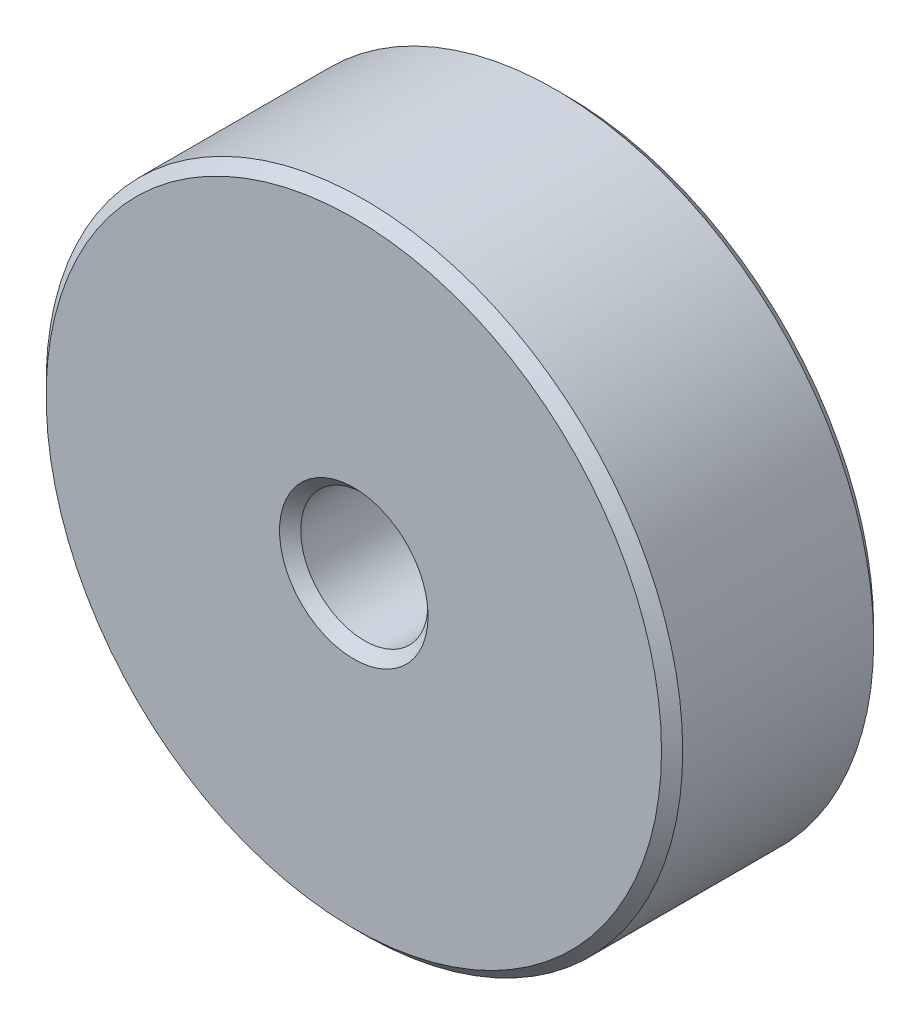
ISO-10303-21;
HEADER;
FILE_DESCRIPTION(('STEP AP214'),'2;1');
FILE_NAME('part.step','',(''),(''),'','','');
FILE_SCHEMA(('AUTOMOTIVE_DESIGN { 1 0 10303 214 1 1 1 1 }'));
ENDSEC;
DATA;
#1=APPLICATION_CONTEXT('core data for automotive mechanical design processes');
#2=APPLICATION_PROTOCOL_DEFINITION('international standard','automotive_design',2000,#1);
#3=PRODUCT_CONTEXT('',#1,'mechanical');
#4=PRODUCT('Part','Part','',(#3));
#5=PRODUCT_RELATED_PRODUCT_CATEGORY('part','',(#4));
#6=PRODUCT_DEFINITION_FORMATION('','',#4);
#7=PRODUCT_DEFINITION_CONTEXT('part definition',#1,'design');
#8=PRODUCT_DEFINITION('design','',#6,#7);
#9=PRODUCT_DEFINITION_SHAPE('','',#8);
#10=(LENGTH_UNIT() NAMED_UNIT(*) SI_UNIT(.MILLI.,.METRE.));
#11=(NAMED_UNIT(*) PLANE_ANGLE_UNIT() SI_UNIT($,.RADIAN.));
#12=(NAMED_UNIT(*) SI_UNIT($,.STERADIAN.) SOLID_ANGLE_UNIT());
#13=UNCERTAINTY_MEASURE_WITH_UNIT(LENGTH_MEASURE(1.E-05),#10,'distance_accuracy_value','');
#14=(GEOMETRIC_REPRESENTATION_CONTEXT(3) GLOBAL_UNCERTAINTY_ASSIGNED_CONTEXT((#13)) GLOBAL_UNIT_ASSIGNED_CONTEXT((#10,
#11,#12)) REPRESENTATION_CONTEXT('',''));
#15=CARTESIAN_POINT('',(0.,0.,0.));
#16=DIRECTION('',(0.,0.,1.));
#17=DIRECTION('',(1.,0.,0.));
#18=AXIS2_PLACEMENT_3D('',#15,#16,#17);
#19=CARTESIAN_POINT('',(0.,0.,10.));
#20=DIRECTION('',(0.,0.,1.));
#21=DIRECTION('',(1.,0.,0.));
#22=AXIS2_PLACEMENT_3D('',#19,#20,#21);
#23=PLANE('',#22);
#24=CARTESIAN_POINT('',(0.,0.,10.));
#25=DIRECTION('',(0.,0.,1.));
#26=DIRECTION('',(1.,0.,0.));
#27=AXIS2_PLACEMENT_3D('',#24,#25,#26);
#28=CIRCLE('',#27,3.5);
#29=CARTESIAN_POINT('',(3.5,0.,10.));
#30=VERTEX_POINT('',#29);
#31=EDGE_CURVE('E40',#30,#30,#28,.F.);
#32=ORIENTED_EDGE('',*,*,#31,.T.);
#33=EDGE_LOOP('',(#32));
#34=FACE_BOUND('',#33,.T.);
#35=CARTESIAN_POINT('',(0.,0.,10.));
#36=DIRECTION('',(0.,0.,1.));
#37=DIRECTION('',(1.,0.,0.));
#38=AXIS2_PLACEMENT_3D('',#35,#36,#37);
#39=CIRCLE('',#38,14.5);
#40=CARTESIAN_POINT('',(14.5,0.,10.));
#41=VERTEX_POINT('',#40);
#42=EDGE_CURVE('E44',#41,#41,#39,.T.);
#43=ORIENTED_EDGE('',*,*,#42,.T.);
#44=EDGE_LOOP('',(#43));
#45=FACE_BOUND('',#44,.T.);
#46=ADVANCED_FACE('F29',(#34,#45),#23,.T.);
#47=CARTESIAN_POINT('',(0.,0.,0.));
#48=DIRECTION('',(0.,0.,1.));
#49=DIRECTION('',(1.,0.,0.));
#50=AXIS2_PLACEMENT_3D('',#47,#48,#49);
#51=PLANE('',#50);
#52=CARTESIAN_POINT('',(0.,0.,0.));
#53=DIRECTION('',(0.,0.,1.));
#54=DIRECTION('',(1.,0.,0.));
#55=AXIS2_PLACEMENT_3D('',#52,#53,#54);
#56=CIRCLE('',#55,3.5);
#57=CARTESIAN_POINT('',(3.5,0.,0.));
#58=VERTEX_POINT('',#57);
#59=EDGE_CURVE('E55',#58,#58,#56,.T.);
#60=ORIENTED_EDGE('',*,*,#59,.T.);
#61=EDGE_LOOP('',(#60));
#62=FACE_BOUND('',#61,.T.);
#63=CARTESIAN_POINT('',(0.,0.,0.));
#64=DIRECTION('',(0.,0.,1.));
#65=DIRECTION('',(1.,0.,0.));
#66=AXIS2_PLACEMENT_3D('',#63,#64,#65);
#67=CIRCLE('',#66,14.5);
#68=CARTESIAN_POINT('',(14.5,0.,0.));
#69=VERTEX_POINT('',#68);
#70=EDGE_CURVE('E58',#69,#69,#67,.F.);
#71=ORIENTED_EDGE('',*,*,#70,.T.);
#72=EDGE_LOOP('',(#71));
#73=FACE_BOUND('',#72,.T.);
#74=ADVANCED_FACE('F62',(#62,#73),#51,.F.);
#75=CARTESIAN_POINT('',(0.,0.,10.));
#76=DIRECTION('',(0.,0.,-1.));
#77=DIRECTION('',(-1.,0.,0.));
#78=AXIS2_PLACEMENT_3D('',#75,#76,#77);
#79=CYLINDRICAL_SURFACE('',#78,15.);
#80=CARTESIAN_POINT('',(0.,0.,0.500000000000002));
#81=DIRECTION('',(0.,0.,1.));
#82=DIRECTION('',(1.,0.,0.));
#83=AXIS2_PLACEMENT_3D('',#80,#81,#82);
#84=CIRCLE('',#83,15.);
#85=CARTESIAN_POINT('',(15.,0.,0.500000000000002));
#86=VERTEX_POINT('',#85);
#87=EDGE_CURVE('E10',#86,#86,#84,.T.);
#88=ORIENTED_EDGE('',*,*,#87,.T.);
#89=EDGE_LOOP('',(#88));
#90=FACE_BOUND('',#89,.T.);
#91=CARTESIAN_POINT('',(0.,0.,9.5));
#92=DIRECTION('',(0.,0.,1.));
#93=DIRECTION('',(1.,0.,0.));
#94=AXIS2_PLACEMENT_3D('',#91,#92,#93);
#95=CIRCLE('',#94,15.);
#96=CARTESIAN_POINT('',(15.,0.,9.5));
#97=VERTEX_POINT('',#96);
#98=EDGE_CURVE('E36',#97,#97,#95,.F.);
#99=ORIENTED_EDGE('',*,*,#98,.T.);
#100=EDGE_LOOP('',(#99));
#101=FACE_BOUND('',#100,.T.);
#102=ADVANCED_FACE('F82',(#90,#101),#79,.T.);
#103=CARTESIAN_POINT('',(0.,0.,10.));
#104=DIRECTION('',(0.,0.,-1.));
#105=DIRECTION('',(-1.,0.,0.));
#106=AXIS2_PLACEMENT_3D('',#103,#104,#105);
#107=CYLINDRICAL_SURFACE('',#106,3.);
#108=CARTESIAN_POINT('',(0.,0.,0.499999999999999));
#109=DIRECTION('',(0.,0.,1.));
#110=DIRECTION('',(1.,0.,0.));
#111=AXIS2_PLACEMENT_3D('',#108,#109,#110);
#112=CIRCLE('',#111,3.);
#113=CARTESIAN_POINT('',(3.,0.,0.499999999999999));
#114=VERTEX_POINT('',#113);
#115=EDGE_CURVE('E49',#114,#114,#112,.F.);
#116=ORIENTED_EDGE('',*,*,#115,.T.);
#117=EDGE_LOOP('',(#116));
#118=FACE_BOUND('',#117,.T.);
#119=CARTESIAN_POINT('',(0.,0.,9.5));
#120=DIRECTION('',(0.,0.,1.));
#121=DIRECTION('',(1.,0.,0.));
#122=AXIS2_PLACEMENT_3D('',#119,#120,#121);
#123=CIRCLE('',#122,3.);
#124=CARTESIAN_POINT('',(3.,0.,9.5));
#125=VERTEX_POINT('',#124);
#126=EDGE_CURVE('E52',#125,#125,#123,.T.);
#127=ORIENTED_EDGE('',*,*,#126,.T.);
#128=EDGE_LOOP('',(#127));
#129=FACE_BOUND('',#128,.T.);
#130=ADVANCED_FACE('F87',(#118,#129),#107,.F.);
#131=CARTESIAN_POINT('',(0.,0.,0.));
#132=DIRECTION('',(0.,0.,-1.));
#133=DIRECTION('',(-1.,0.,0.));
#134=AXIS2_PLACEMENT_3D('',#131,#132,#133);
#135=CONICAL_SURFACE('',#134,3.5,0.785398163397449);
#136=ORIENTED_EDGE('',*,*,#115,.F.);
#137=EDGE_LOOP('',(#136));
#138=FACE_BOUND('',#137,.T.);
#139=ORIENTED_EDGE('',*,*,#59,.F.);
#140=EDGE_LOOP('',(#139));
#141=FACE_BOUND('',#140,.T.);
#142=ADVANCED_FACE('F73',(#138,#141),#135,.F.);
#143=CARTESIAN_POINT('',(0.,0.,9.5));
#144=DIRECTION('',(0.,0.,1.));
#145=DIRECTION('',(1.,0.,0.));
#146=AXIS2_PLACEMENT_3D('',#143,#144,#145);
#147=CONICAL_SURFACE('',#146,3.,0.785398163397451);
#148=ORIENTED_EDGE('',*,*,#31,.F.);
#149=EDGE_LOOP('',(#148));
#150=FACE_BOUND('',#149,.T.);
#151=ORIENTED_EDGE('',*,*,#126,.F.);
#152=EDGE_LOOP('',(#151));
#153=FACE_BOUND('',#152,.T.);
#154=ADVANCED_FACE('F67',(#150,#153),#147,.F.);
#155=CARTESIAN_POINT('',(0.,0.,0.500000000000002));
#156=DIRECTION('',(0.,0.,1.));
#157=DIRECTION('',(1.,0.,0.));
#158=AXIS2_PLACEMENT_3D('',#155,#156,#157);
#159=CONICAL_SURFACE('',#158,15.,0.785398163397448);
#160=ORIENTED_EDGE('',*,*,#70,.F.);
#161=EDGE_LOOP('',(#160));
#162=FACE_BOUND('',#161,.T.);
#163=ORIENTED_EDGE('',*,*,#87,.F.);
#164=EDGE_LOOP('',(#163));
#165=FACE_BOUND('',#164,.T.);
#166=ADVANCED_FACE('F64',(#162,#165),#159,.T.);
#167=CARTESIAN_POINT('',(0.,0.,10.));
#168=DIRECTION('',(0.,0.,-1.));
#169=DIRECTION('',(-1.,0.,0.));
#170=AXIS2_PLACEMENT_3D('',#167,#168,#169);
#171=CONICAL_SURFACE('',#170,14.5,0.785398163397447);
#172=ORIENTED_EDGE('',*,*,#98,.F.);
#173=EDGE_LOOP('',(#172));
#174=FACE_BOUND('',#173,.T.);
#175=ORIENTED_EDGE('',*,*,#42,.F.);
#176=EDGE_LOOP('',(#175));
#177=FACE_BOUND('',#176,.T.);
#178=ADVANCED_FACE('F31',(#174,#177),#171,.T.);
#179=CLOSED_SHELL('',(#46,#74,#102,#130,#142,#154,#166,#178));
#180=MANIFOLD_SOLID_BREP('B2',#179);
#181=ADVANCED_BREP_SHAPE_REPRESENTATION('',(#18,#180),#14);
#182=SHAPE_DEFINITION_REPRESENTATION(#9,#181);
ENDSEC;
END-ISO-10303-21;
